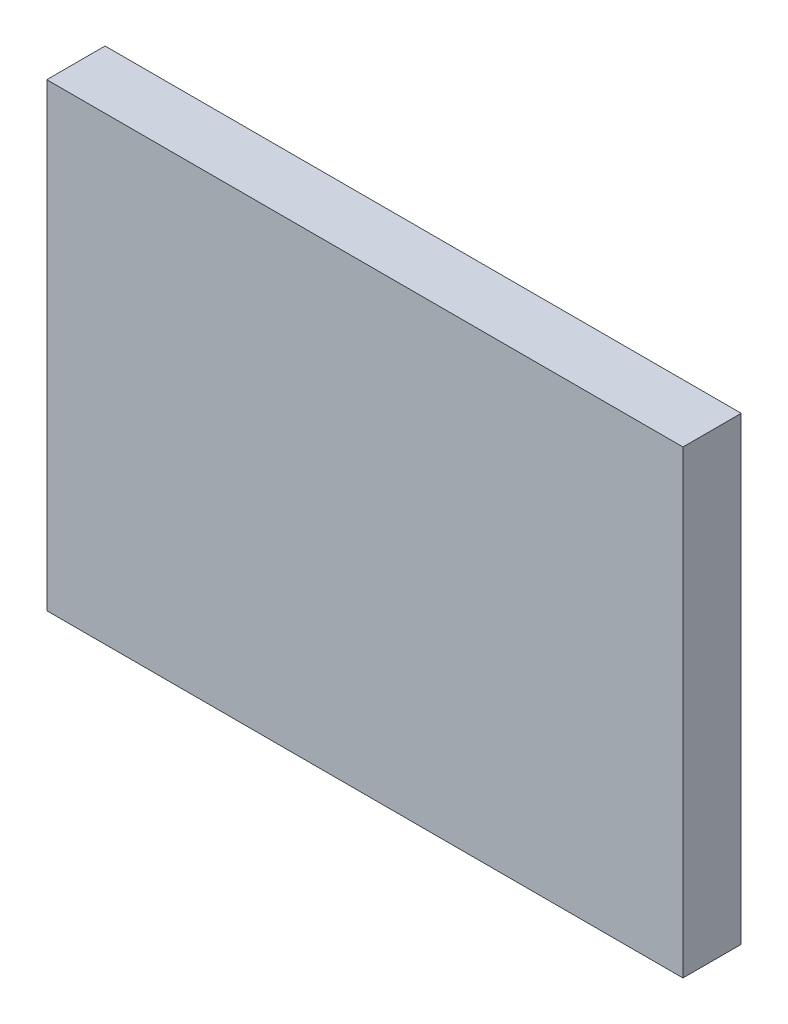
ISO-10303-21;
HEADER;
FILE_DESCRIPTION(('STEP AP214'),'2;1');
FILE_NAME('part.step','',(''),(''),'','','');
FILE_SCHEMA(('AUTOMOTIVE_DESIGN { 1 0 10303 214 1 1 1 1 }'));
ENDSEC;
DATA;
#1=APPLICATION_CONTEXT('core data for automotive mechanical design processes');
#2=APPLICATION_PROTOCOL_DEFINITION('international standard','automotive_design',2000,#1);
#3=PRODUCT_CONTEXT('',#1,'mechanical');
#4=PRODUCT('Part','Part','',(#3));
#5=PRODUCT_RELATED_PRODUCT_CATEGORY('part','',(#4));
#6=PRODUCT_DEFINITION_FORMATION('','',#4);
#7=PRODUCT_DEFINITION_CONTEXT('part definition',#1,'design');
#8=PRODUCT_DEFINITION('design','',#6,#7);
#9=PRODUCT_DEFINITION_SHAPE('','',#8);
#10=(LENGTH_UNIT() NAMED_UNIT(*) SI_UNIT(.MILLI.,.METRE.));
#11=(NAMED_UNIT(*) PLANE_ANGLE_UNIT() SI_UNIT($,.RADIAN.));
#12=(NAMED_UNIT(*) SI_UNIT($,.STERADIAN.) SOLID_ANGLE_UNIT());
#13=UNCERTAINTY_MEASURE_WITH_UNIT(LENGTH_MEASURE(1.E-05),#10,'distance_accuracy_value','');
#14=(GEOMETRIC_REPRESENTATION_CONTEXT(3) GLOBAL_UNCERTAINTY_ASSIGNED_CONTEXT((#13)) GLOBAL_UNIT_ASSIGNED_CONTEXT((#10,
#11,#12)) REPRESENTATION_CONTEXT('',''));
#15=CARTESIAN_POINT('',(0.,0.,0.));
#16=DIRECTION('',(0.,0.,1.));
#17=DIRECTION('',(1.,0.,0.));
#18=AXIS2_PLACEMENT_3D('',#15,#16,#17);
#19=CARTESIAN_POINT('',(0.,0.,0.));
#20=DIRECTION('',(0.,0.,-1.));
#21=DIRECTION('',(-1.,0.,0.));
#22=AXIS2_PLACEMENT_3D('',#19,#20,#21);
#23=PLANE('',#22);
#24=DIRECTION('',(-1.,0.,0.));
#25=VECTOR('',#24,1.);
#26=CARTESIAN_POINT('',(6.912,3.888,0.));
#27=LINE('',#26,#25);
#28=CARTESIAN_POINT('',(6.912,3.888,0.));
#29=VERTEX_POINT('',#28);
#30=CARTESIAN_POINT('',(0.,3.888,0.));
#31=VERTEX_POINT('',#30);
#32=EDGE_CURVE('E218',#29,#31,#27,.T.);
#33=ORIENTED_EDGE('',*,*,#32,.F.);
#34=DIRECTION('',(0.,1.,0.));
#35=VECTOR('',#34,1.);
#36=CARTESIAN_POINT('',(6.912,0.,0.));
#37=LINE('',#36,#35);
#38=CARTESIAN_POINT('',(6.912,0.,0.));
#39=VERTEX_POINT('',#38);
#40=EDGE_CURVE('E224',#39,#29,#37,.T.);
#41=ORIENTED_EDGE('',*,*,#40,.F.);
#42=DIRECTION('',(-1.,0.,0.));
#43=VECTOR('',#42,1.);
#44=CARTESIAN_POINT('',(6.912,0.,0.));
#45=LINE('',#44,#43);
#46=CARTESIAN_POINT('',(0.,0.,0.));
#47=VERTEX_POINT('',#46);
#48=EDGE_CURVE('E244',#39,#47,#45,.T.);
#49=ORIENTED_EDGE('',*,*,#48,.T.);
#50=DIRECTION('',(0.,1.,0.));
#51=VECTOR('',#50,1.);
#52=CARTESIAN_POINT('',(0.,0.,0.));
#53=LINE('',#52,#51);
#54=EDGE_CURVE('E240',#47,#31,#53,.T.);
#55=ORIENTED_EDGE('',*,*,#54,.T.);
#56=EDGE_LOOP('',(#33,#41,#49,#55));
#57=FACE_BOUND('',#56,.T.);
#58=DIRECTION('',(-0.707106781186548,0.707106781186548,0.));
#59=VECTOR('',#58,1.);
#60=CARTESIAN_POINT('',(2.45506125524031,2.45506125524031,0.));
#61=LINE('',#60,#59);
#62=CARTESIAN_POINT('',(3.46106125524031,1.44906125524031,0.));
#63=VERTEX_POINT('',#62);
#64=CARTESIAN_POINT('',(2.96106125524031,1.94906125524031,0.));
#65=VERTEX_POINT('',#64);
#66=EDGE_CURVE('E57',#63,#65,#61,.T.);
#67=ORIENTED_EDGE('',*,*,#66,.F.);
#68=DIRECTION('',(-0.707106781186548,-0.707106781186547,0.));
#69=VECTOR('',#68,1.);
#70=CARTESIAN_POINT('',(1.006,-1.006,0.));
#71=LINE('',#70,#69);
#72=CARTESIAN_POINT('',(3.956,1.944,0.));
#73=VERTEX_POINT('',#72);
#74=EDGE_CURVE('E425',#73,#63,#71,.T.);
#75=ORIENTED_EDGE('',*,*,#74,.F.);
#76=DIRECTION('',(-0.707106781186548,0.707106781186548,0.));
#77=VECTOR('',#76,1.);
#78=CARTESIAN_POINT('',(2.95,2.95,0.));
#79=LINE('',#78,#77);
#80=CARTESIAN_POINT('',(3.456,2.444,0.));
#81=VERTEX_POINT('',#80);
#82=EDGE_CURVE('E161',#73,#81,#79,.T.);
#83=ORIENTED_EDGE('',*,*,#82,.T.);
#84=DIRECTION('',(-0.707106781186548,-0.707106781186547,0.));
#85=VECTOR('',#84,1.);
#86=CARTESIAN_POINT('',(0.505999999999999,-0.506,0.));
#87=LINE('',#86,#85);
#88=EDGE_CURVE('E62',#81,#65,#87,.T.);
#89=ORIENTED_EDGE('',*,*,#88,.T.);
#90=EDGE_LOOP('',(#67,#75,#83,#89));
#91=FACE_BOUND('',#90,.T.);
#92=ADVANCED_FACE('F41',(#57,#91),#23,.T.);
#93=CARTESIAN_POINT('',(6.912,3.888,1.));
#94=DIRECTION('',(0.,-1.,0.));
#95=DIRECTION('',(1.,0.,0.));
#96=AXIS2_PLACEMENT_3D('',#93,#94,#95);
#97=PLANE('',#96);
#98=ORIENTED_EDGE('',*,*,#32,.T.);
#99=DIRECTION('',(0.,0.,-1.));
#100=VECTOR('',#99,1.);
#101=CARTESIAN_POINT('',(0.,3.888,1.));
#102=LINE('',#101,#100);
#103=CARTESIAN_POINT('',(0.,3.888,1.));
#104=VERTEX_POINT('',#103);
#105=EDGE_CURVE('E11',#104,#31,#102,.T.);
#106=ORIENTED_EDGE('',*,*,#105,.F.);
#107=DIRECTION('',(-1.,0.,0.));
#108=VECTOR('',#107,1.);
#109=CARTESIAN_POINT('',(6.912,3.888,1.));
#110=LINE('',#109,#108);
#111=CARTESIAN_POINT('',(6.912,3.888,1.));
#112=VERTEX_POINT('',#111);
#113=EDGE_CURVE('E219',#112,#104,#110,.T.);
#114=ORIENTED_EDGE('',*,*,#113,.F.);
#115=DIRECTION('',(0.,0.,-1.));
#116=VECTOR('',#115,1.);
#117=CARTESIAN_POINT('',(6.912,3.888,1.));
#118=LINE('',#117,#116);
#119=EDGE_CURVE('E236',#112,#29,#118,.T.);
#120=ORIENTED_EDGE('',*,*,#119,.T.);
#121=EDGE_LOOP('',(#98,#106,#114,#120));
#122=FACE_BOUND('',#121,.T.);
#123=ADVANCED_FACE('F43',(#122),#97,.F.);
#124=CARTESIAN_POINT('',(0.,0.,1.));
#125=DIRECTION('',(-1.,0.,0.));
#126=DIRECTION('',(0.,-1.,0.));
#127=AXIS2_PLACEMENT_3D('',#124,#125,#126);
#128=PLANE('',#127);
#129=ORIENTED_EDGE('',*,*,#54,.F.);
#130=DIRECTION('',(0.,0.,-1.));
#131=VECTOR('',#130,1.);
#132=CARTESIAN_POINT('',(0.,0.,1.));
#133=LINE('',#132,#131);
#134=CARTESIAN_POINT('',(0.,0.,1.));
#135=VERTEX_POINT('',#134);
#136=EDGE_CURVE('E50',#135,#47,#133,.T.);
#137=ORIENTED_EDGE('',*,*,#136,.F.);
#138=DIRECTION('',(0.,1.,0.));
#139=VECTOR('',#138,1.);
#140=CARTESIAN_POINT('',(0.,0.,1.));
#141=LINE('',#140,#139);
#142=EDGE_CURVE('E223',#135,#104,#141,.T.);
#143=ORIENTED_EDGE('',*,*,#142,.T.);
#144=ORIENTED_EDGE('',*,*,#105,.T.);
#145=EDGE_LOOP('',(#129,#137,#143,#144));
#146=FACE_BOUND('',#145,.T.);
#147=ADVANCED_FACE('F263',(#146),#128,.T.);
#148=CARTESIAN_POINT('',(6.912,0.,1.));
#149=DIRECTION('',(0.,-1.,0.));
#150=DIRECTION('',(0.,0.,-1.));
#151=AXIS2_PLACEMENT_3D('',#148,#149,#150);
#152=PLANE('',#151);
#153=ORIENTED_EDGE('',*,*,#48,.F.);
#154=DIRECTION('',(0.,0.,-1.));
#155=VECTOR('',#154,1.);
#156=CARTESIAN_POINT('',(6.912,0.,1.));
#157=LINE('',#156,#155);
#158=CARTESIAN_POINT('',(6.912,0.,1.));
#159=VERTEX_POINT('',#158);
#160=EDGE_CURVE('E253',#159,#39,#157,.T.);
#161=ORIENTED_EDGE('',*,*,#160,.F.);
#162=DIRECTION('',(-1.,0.,0.));
#163=VECTOR('',#162,1.);
#164=CARTESIAN_POINT('',(6.912,0.,1.));
#165=LINE('',#164,#163);
#166=EDGE_CURVE('E228',#159,#135,#165,.T.);
#167=ORIENTED_EDGE('',*,*,#166,.T.);
#168=ORIENTED_EDGE('',*,*,#136,.T.);
#169=EDGE_LOOP('',(#153,#161,#167,#168));
#170=FACE_BOUND('',#169,.T.);
#171=ADVANCED_FACE('F259',(#170),#152,.T.);
#172=CARTESIAN_POINT('',(6.912,0.,1.));
#173=DIRECTION('',(-1.,0.,0.));
#174=DIRECTION('',(0.,0.,1.));
#175=AXIS2_PLACEMENT_3D('',#172,#173,#174);
#176=PLANE('',#175);
#177=ORIENTED_EDGE('',*,*,#40,.T.);
#178=ORIENTED_EDGE('',*,*,#119,.F.);
#179=DIRECTION('',(0.,1.,0.));
#180=VECTOR('',#179,1.);
#181=CARTESIAN_POINT('',(6.912,0.,1.));
#182=LINE('',#181,#180);
#183=EDGE_CURVE('E232',#159,#112,#182,.T.);
#184=ORIENTED_EDGE('',*,*,#183,.F.);
#185=ORIENTED_EDGE('',*,*,#160,.T.);
#186=EDGE_LOOP('',(#177,#178,#184,#185));
#187=FACE_BOUND('',#186,.T.);
#188=ADVANCED_FACE('F269',(#187),#176,.F.);
#189=CARTESIAN_POINT('',(-2.,-2.,2.));
#190=DIRECTION('',(0.,1.,0.));
#191=DIRECTION('',(0.,0.,1.));
#192=AXIS2_PLACEMENT_3D('',#189,#190,#191);
#193=PLANE('',#192);
#194=DIRECTION('',(1.,0.,0.));
#195=VECTOR('',#194,1.);
#196=CARTESIAN_POINT('',(-2.,-2.,1.));
#197=LINE('',#196,#195);
#198=CARTESIAN_POINT('',(-2.,-2.,1.));
#199=VERTEX_POINT('',#198);
#200=CARTESIAN_POINT('',(8.912,-2.,1.));
#201=VERTEX_POINT('',#200);
#202=EDGE_CURVE('E176',#199,#201,#197,.T.);
#203=ORIENTED_EDGE('',*,*,#202,.T.);
#204=DIRECTION('',(0.,0.,-1.));
#205=VECTOR('',#204,1.);
#206=CARTESIAN_POINT('',(8.912,-2.,2.));
#207=LINE('',#206,#205);
#208=CARTESIAN_POINT('',(8.912,-2.,2.));
#209=VERTEX_POINT('',#208);
#210=EDGE_CURVE('E215',#209,#201,#207,.T.);
#211=ORIENTED_EDGE('',*,*,#210,.F.);
#212=DIRECTION('',(1.,0.,0.));
#213=VECTOR('',#212,1.);
#214=CARTESIAN_POINT('',(-2.,-2.,2.));
#215=LINE('',#214,#213);
#216=CARTESIAN_POINT('',(-2.,-2.,2.));
#217=VERTEX_POINT('',#216);
#218=EDGE_CURVE('E177',#217,#209,#215,.T.);
#219=ORIENTED_EDGE('',*,*,#218,.F.);
#220=DIRECTION('',(0.,0.,-1.));
#221=VECTOR('',#220,1.);
#222=CARTESIAN_POINT('',(-2.,-2.,2.));
#223=LINE('',#222,#221);
#224=EDGE_CURVE('E192',#217,#199,#223,.T.);
#225=ORIENTED_EDGE('',*,*,#224,.T.);
#226=EDGE_LOOP('',(#203,#211,#219,#225));
#227=FACE_BOUND('',#226,.T.);
#228=ADVANCED_FACE('F284',(#227),#193,.F.);
#229=CARTESIAN_POINT('',(8.912,5.888,2.));
#230=DIRECTION('',(1.,0.,0.));
#231=DIRECTION('',(0.,0.,-1.));
#232=AXIS2_PLACEMENT_3D('',#229,#230,#231);
#233=PLANE('',#232);
#234=DIRECTION('',(0.,-1.,0.));
#235=VECTOR('',#234,1.);
#236=CARTESIAN_POINT('',(8.912,5.888,1.));
#237=LINE('',#236,#235);
#238=CARTESIAN_POINT('',(8.912,5.888,1.));
#239=VERTEX_POINT('',#238);
#240=EDGE_CURVE('E196',#239,#201,#237,.T.);
#241=ORIENTED_EDGE('',*,*,#240,.F.);
#242=DIRECTION('',(0.,0.,-1.));
#243=VECTOR('',#242,1.);
#244=CARTESIAN_POINT('',(8.912,5.888,2.));
#245=LINE('',#244,#243);
#246=CARTESIAN_POINT('',(8.912,5.888,2.));
#247=VERTEX_POINT('',#246);
#248=EDGE_CURVE('E212',#247,#239,#245,.T.);
#249=ORIENTED_EDGE('',*,*,#248,.F.);
#250=DIRECTION('',(0.,-1.,0.));
#251=VECTOR('',#250,1.);
#252=CARTESIAN_POINT('',(8.912,5.888,2.));
#253=LINE('',#252,#251);
#254=EDGE_CURVE('E180',#247,#209,#253,.T.);
#255=ORIENTED_EDGE('',*,*,#254,.T.);
#256=ORIENTED_EDGE('',*,*,#210,.T.);
#257=EDGE_LOOP('',(#241,#249,#255,#256));
#258=FACE_BOUND('',#257,.T.);
#259=ADVANCED_FACE('F295',(#258),#233,.T.);
#260=CARTESIAN_POINT('',(-2.,5.888,2.));
#261=DIRECTION('',(0.,1.,0.));
#262=DIRECTION('',(0.,0.,1.));
#263=AXIS2_PLACEMENT_3D('',#260,#261,#262);
#264=PLANE('',#263);
#265=DIRECTION('',(1.,0.,0.));
#266=VECTOR('',#265,1.);
#267=CARTESIAN_POINT('',(-2.,5.888,1.));
#268=LINE('',#267,#266);
#269=CARTESIAN_POINT('',(-2.,5.888,1.));
#270=VERTEX_POINT('',#269);
#271=EDGE_CURVE('E200',#270,#239,#268,.T.);
#272=ORIENTED_EDGE('',*,*,#271,.F.);
#273=DIRECTION('',(0.,0.,-1.));
#274=VECTOR('',#273,1.);
#275=CARTESIAN_POINT('',(-2.,5.888,2.));
#276=LINE('',#275,#274);
#277=CARTESIAN_POINT('',(-2.,5.888,2.));
#278=VERTEX_POINT('',#277);
#279=EDGE_CURVE('E209',#278,#270,#276,.T.);
#280=ORIENTED_EDGE('',*,*,#279,.F.);
#281=DIRECTION('',(1.,0.,0.));
#282=VECTOR('',#281,1.);
#283=CARTESIAN_POINT('',(-2.,5.888,2.));
#284=LINE('',#283,#282);
#285=EDGE_CURVE('E185',#278,#247,#284,.T.);
#286=ORIENTED_EDGE('',*,*,#285,.T.);
#287=ORIENTED_EDGE('',*,*,#248,.T.);
#288=EDGE_LOOP('',(#272,#280,#286,#287));
#289=FACE_BOUND('',#288,.T.);
#290=ADVANCED_FACE('F292',(#289),#264,.T.);
#291=CARTESIAN_POINT('',(-2.,5.888,2.));
#292=DIRECTION('',(1.,0.,0.));
#293=DIRECTION('',(0.,1.,0.));
#294=AXIS2_PLACEMENT_3D('',#291,#292,#293);
#295=PLANE('',#294);
#296=DIRECTION('',(0.,-1.,0.));
#297=VECTOR('',#296,1.);
#298=CARTESIAN_POINT('',(-2.,5.888,1.));
#299=LINE('',#298,#297);
#300=EDGE_CURVE('E181',#270,#199,#299,.T.);
#301=ORIENTED_EDGE('',*,*,#300,.T.);
#302=ORIENTED_EDGE('',*,*,#224,.F.);
#303=DIRECTION('',(0.,-1.,0.));
#304=VECTOR('',#303,1.);
#305=CARTESIAN_POINT('',(-2.,5.888,2.));
#306=LINE('',#305,#304);
#307=EDGE_CURVE('E189',#278,#217,#306,.T.);
#308=ORIENTED_EDGE('',*,*,#307,.F.);
#309=ORIENTED_EDGE('',*,*,#279,.T.);
#310=EDGE_LOOP('',(#301,#302,#308,#309));
#311=FACE_BOUND('',#310,.T.);
#312=ADVANCED_FACE('F289',(#311),#295,.F.);
#313=CARTESIAN_POINT('',(0.,0.,2.));
#314=DIRECTION('',(0.,0.,-1.));
#315=DIRECTION('',(-1.,0.,0.));
#316=AXIS2_PLACEMENT_3D('',#313,#314,#315);
#317=PLANE('',#316);
#318=ORIENTED_EDGE('',*,*,#218,.T.);
#319=ORIENTED_EDGE('',*,*,#254,.F.);
#320=ORIENTED_EDGE('',*,*,#285,.F.);
#321=ORIENTED_EDGE('',*,*,#307,.T.);
#322=EDGE_LOOP('',(#318,#319,#320,#321));
#323=FACE_BOUND('',#322,.T.);
#324=ADVANCED_FACE('F276',(#323),#317,.F.);
#325=CARTESIAN_POINT('',(0.,0.,1.));
#326=DIRECTION('',(0.,0.,-1.));
#327=DIRECTION('',(-1.,0.,0.));
#328=AXIS2_PLACEMENT_3D('',#325,#326,#327);
#329=PLANE('',#328);
#330=ORIENTED_EDGE('',*,*,#183,.T.);
#331=ORIENTED_EDGE('',*,*,#113,.T.);
#332=ORIENTED_EDGE('',*,*,#142,.F.);
#333=ORIENTED_EDGE('',*,*,#166,.F.);
#334=EDGE_LOOP('',(#330,#331,#332,#333));
#335=FACE_BOUND('',#334,.T.);
#336=ORIENTED_EDGE('',*,*,#202,.F.);
#337=ORIENTED_EDGE('',*,*,#300,.F.);
#338=ORIENTED_EDGE('',*,*,#271,.T.);
#339=ORIENTED_EDGE('',*,*,#240,.T.);
#340=EDGE_LOOP('',(#336,#337,#338,#339));
#341=FACE_BOUND('',#340,.T.);
#342=ADVANCED_FACE('F273',(#335,#341),#329,.T.);
#343=CARTESIAN_POINT('',(1.006,-1.006,-0.0306));
#344=DIRECTION('',(-0.707106781186547,0.707106781186548,0.));
#345=DIRECTION('',(-0.707106781186548,-0.707106781186547,0.));
#346=AXIS2_PLACEMENT_3D('',#343,#344,#345);
#347=PLANE('',#346);
#348=DIRECTION('',(0.,0.,1.));
#349=VECTOR('',#348,1.);
#350=CARTESIAN_POINT('',(3.46106125524031,1.44906125524031,-0.0306));
#351=LINE('',#350,#349);
#352=CARTESIAN_POINT('',(3.46106125524031,1.44906125524031,-0.0306));
#353=VERTEX_POINT('',#352);
#354=EDGE_CURVE('E173',#353,#63,#351,.T.);
#355=ORIENTED_EDGE('',*,*,#354,.F.);
#356=DIRECTION('',(-0.706432031051466,-0.706432031051465,-0.0436757485225178));
#357=VECTOR('',#356,1.);
#358=CARTESIAN_POINT('',(3.70853062762016,1.69653062762015,-0.0153));
#359=LINE('',#358,#357);
#360=CARTESIAN_POINT('',(3.70853062762016,1.69653062762015,-0.0153));
#361=VERTEX_POINT('',#360);
#362=EDGE_CURVE('E157',#361,#353,#359,.T.);
#363=ORIENTED_EDGE('',*,*,#362,.F.);
#364=DIRECTION('',(-0.706432031051466,-0.706432031051466,0.0436757485225178));
#365=VECTOR('',#364,1.);
#366=CARTESIAN_POINT('',(3.956,1.944,-0.0306));
#367=LINE('',#366,#365);
#368=CARTESIAN_POINT('',(3.956,1.944,-0.0306));
#369=VERTEX_POINT('',#368);
#370=EDGE_CURVE('E139',#369,#361,#367,.T.);
#371=ORIENTED_EDGE('',*,*,#370,.F.);
#372=DIRECTION('',(0.,0.,1.));
#373=VECTOR('',#372,1.);
#374=CARTESIAN_POINT('',(3.956,1.944,-0.0306));
#375=LINE('',#374,#373);
#376=EDGE_CURVE('E148',#369,#73,#375,.T.);
#377=ORIENTED_EDGE('',*,*,#376,.T.);
#378=ORIENTED_EDGE('',*,*,#74,.T.);
#379=EDGE_LOOP('',(#355,#363,#371,#377,#378));
#380=FACE_BOUND('',#379,.T.);
#381=ADVANCED_FACE('F154',(#380),#347,.F.);
#382=CARTESIAN_POINT('',(2.45506125524031,2.45506125524031,-0.0306));
#383=DIRECTION('',(0.707106781186548,0.707106781186548,0.));
#384=DIRECTION('',(-0.707106781186548,0.707106781186548,0.));
#385=AXIS2_PLACEMENT_3D('',#382,#383,#384);
#386=PLANE('',#385);
#387=ORIENTED_EDGE('',*,*,#66,.T.);
#388=DIRECTION('',(0.,0.,1.));
#389=VECTOR('',#388,1.);
#390=CARTESIAN_POINT('',(2.96106125524031,1.94906125524031,-0.0306));
#391=LINE('',#390,#389);
#392=CARTESIAN_POINT('',(2.96106125524031,1.94906125524031,-0.0306));
#393=VERTEX_POINT('',#392);
#394=EDGE_CURVE('E166',#393,#65,#391,.T.);
#395=ORIENTED_EDGE('',*,*,#394,.F.);
#396=DIRECTION('',(-0.707106781186548,0.707106781186548,0.));
#397=VECTOR('',#396,1.);
#398=CARTESIAN_POINT('',(2.45506125524031,2.45506125524031,-0.0306));
#399=LINE('',#398,#397);
#400=EDGE_CURVE('E149',#353,#393,#399,.T.);
#401=ORIENTED_EDGE('',*,*,#400,.F.);
#402=ORIENTED_EDGE('',*,*,#354,.T.);
#403=EDGE_LOOP('',(#387,#395,#401,#402));
#404=FACE_BOUND('',#403,.T.);
#405=ADVANCED_FACE('F371',(#404),#386,.F.);
#406=CARTESIAN_POINT('',(0.505999999999999,-0.506,-0.0306));
#407=DIRECTION('',(-0.707106781186547,0.707106781186548,0.));
#408=DIRECTION('',(-0.707106781186548,-0.707106781186547,0.));
#409=AXIS2_PLACEMENT_3D('',#406,#407,#408);
#410=PLANE('',#409);
#411=DIRECTION('',(0.706432031051466,0.706432031051465,0.0436757485225178));
#412=VECTOR('',#411,1.);
#413=CARTESIAN_POINT('',(0.51068320367582,-0.501316796324179,-0.182096663317962));
#414=LINE('',#413,#412);
#415=CARTESIAN_POINT('',(3.20853062762016,2.19653062762015,-0.0153));
#416=VERTEX_POINT('',#415);
#417=EDGE_CURVE('E420',#393,#416,#414,.T.);
#418=ORIENTED_EDGE('',*,*,#417,.F.);
#419=ORIENTED_EDGE('',*,*,#394,.T.);
#420=ORIENTED_EDGE('',*,*,#88,.F.);
#421=DIRECTION('',(0.,0.,1.));
#422=VECTOR('',#421,1.);
#423=CARTESIAN_POINT('',(3.456,2.444,-0.0306));
#424=LINE('',#423,#422);
#425=CARTESIAN_POINT('',(3.456,2.444,-0.0306));
#426=VERTEX_POINT('',#425);
#427=EDGE_CURVE('E163',#426,#81,#424,.T.);
#428=ORIENTED_EDGE('',*,*,#427,.F.);
#429=DIRECTION('',(0.706432031051466,0.706432031051465,-0.0436757485225178));
#430=VECTOR('',#429,1.);
#431=CARTESIAN_POINT('',(0.511627334476556,-0.500372665523443,0.151438291645086));
#432=LINE('',#431,#430);
#433=EDGE_CURVE('E142',#416,#426,#432,.T.);
#434=ORIENTED_EDGE('',*,*,#433,.F.);
#435=EDGE_LOOP('',(#418,#419,#420,#428,#434));
#436=FACE_BOUND('',#435,.T.);
#437=ADVANCED_FACE('F376',(#436),#410,.T.);
#438=CARTESIAN_POINT('',(2.95,2.95,-0.0306));
#439=DIRECTION('',(0.707106781186548,0.707106781186548,0.));
#440=DIRECTION('',(-0.707106781186548,0.707106781186548,0.));
#441=AXIS2_PLACEMENT_3D('',#438,#439,#440);
#442=PLANE('',#441);
#443=ORIENTED_EDGE('',*,*,#82,.F.);
#444=ORIENTED_EDGE('',*,*,#376,.F.);
#445=DIRECTION('',(-0.707106781186548,0.707106781186548,0.));
#446=VECTOR('',#445,1.);
#447=CARTESIAN_POINT('',(2.95,2.95,-0.0306));
#448=LINE('',#447,#446);
#449=EDGE_CURVE('E135',#369,#426,#448,.T.);
#450=ORIENTED_EDGE('',*,*,#449,.T.);
#451=ORIENTED_EDGE('',*,*,#427,.T.);
#452=EDGE_LOOP('',(#443,#444,#450,#451));
#453=FACE_BOUND('',#452,.T.);
#454=ADVANCED_FACE('F160',(#453),#442,.T.);
#455=CARTESIAN_POINT('',(-3.36253718424532,8.76759843948563,-0.0153));
#456=DIRECTION('',(-0.0308834179536707,-0.0308834179536707,0.999045759207754));
#457=DIRECTION('',(0.999522537975116,0.,0.030898156575809));
#458=AXIS2_PLACEMENT_3D('',#455,#456,#457);
#459=PLANE('',#458);
#460=ORIENTED_EDGE('',*,*,#417,.T.);
#461=DIRECTION('',(0.707106781186547,-0.707106781186548,0.));
#462=VECTOR('',#461,1.);
#463=CARTESIAN_POINT('',(-3.36253718424532,8.76759843948563,-0.0153));
#464=LINE('',#463,#462);
#465=EDGE_CURVE('E421',#416,#361,#464,.T.);
#466=ORIENTED_EDGE('',*,*,#465,.T.);
#467=ORIENTED_EDGE('',*,*,#362,.T.);
#468=ORIENTED_EDGE('',*,*,#400,.T.);
#469=EDGE_LOOP('',(#460,#466,#467,#468));
#470=FACE_BOUND('',#469,.T.);
#471=ADVANCED_FACE('F391',(#470),#459,.F.);
#472=CARTESIAN_POINT('',(-3.11506781186547,9.01506781186548,-0.0306));
#473=DIRECTION('',(0.0308834179536707,0.0308834179536707,0.999045759207754));
#474=DIRECTION('',(0.999522537975116,0.,-0.030898156575809));
#475=AXIS2_PLACEMENT_3D('',#472,#473,#474);
#476=PLANE('',#475);
#477=ORIENTED_EDGE('',*,*,#433,.T.);
#478=ORIENTED_EDGE('',*,*,#449,.F.);
#479=ORIENTED_EDGE('',*,*,#370,.T.);
#480=ORIENTED_EDGE('',*,*,#465,.F.);
#481=EDGE_LOOP('',(#477,#478,#479,#480));
#482=FACE_BOUND('',#481,.T.);
#483=ADVANCED_FACE('F137',(#482),#476,.F.);
#484=CLOSED_SHELL('',(#92,#123,#147,#171,#188,#228,#259,#290,#312,#324,#342,#381,#405,#437,#454,
#471,#483));
#485=MANIFOLD_SOLID_BREP('B2',#484);
#486=ADVANCED_BREP_SHAPE_REPRESENTATION('',(#18,#485),#14);
#487=SHAPE_DEFINITION_REPRESENTATION(#9,#486);
ENDSEC;
END-ISO-10303-21;
